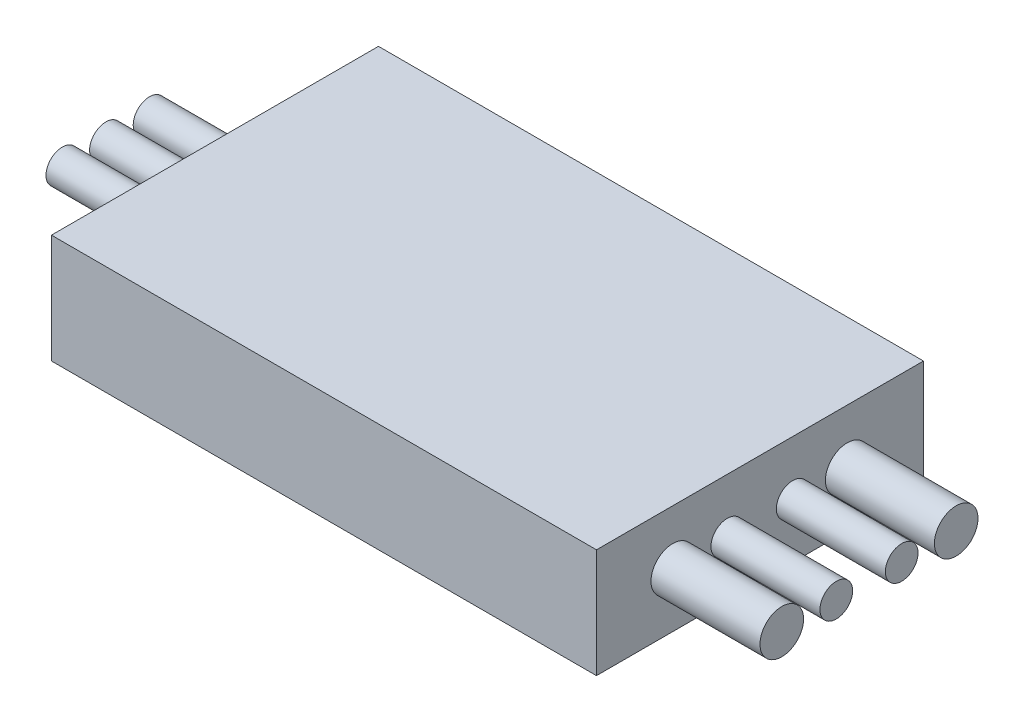
ISO-10303-21;
HEADER;
FILE_DESCRIPTION(('STEP AP214'),'2;1');
FILE_NAME('part.step','',(''),(''),'','','');
FILE_SCHEMA(('AUTOMOTIVE_DESIGN { 1 0 10303 214 1 1 1 1 }'));
ENDSEC;
DATA;
#1=APPLICATION_CONTEXT('core data for automotive mechanical design processes');
#2=APPLICATION_PROTOCOL_DEFINITION('international standard','automotive_design',2000,#1);
#3=PRODUCT_CONTEXT('',#1,'mechanical');
#4=PRODUCT('Part','Part','',(#3));
#5=PRODUCT_RELATED_PRODUCT_CATEGORY('part','',(#4));
#6=PRODUCT_DEFINITION_FORMATION('','',#4);
#7=PRODUCT_DEFINITION_CONTEXT('part definition',#1,'design');
#8=PRODUCT_DEFINITION('design','',#6,#7);
#9=PRODUCT_DEFINITION_SHAPE('','',#8);
#10=(LENGTH_UNIT() NAMED_UNIT(*) SI_UNIT(.MILLI.,.METRE.));
#11=(NAMED_UNIT(*) PLANE_ANGLE_UNIT() SI_UNIT($,.RADIAN.));
#12=(NAMED_UNIT(*) SI_UNIT($,.STERADIAN.) SOLID_ANGLE_UNIT());
#13=UNCERTAINTY_MEASURE_WITH_UNIT(LENGTH_MEASURE(1.E-05),#10,'distance_accuracy_value','');
#14=(GEOMETRIC_REPRESENTATION_CONTEXT(3) GLOBAL_UNCERTAINTY_ASSIGNED_CONTEXT((#13)) GLOBAL_UNIT_ASSIGNED_CONTEXT((#10,
#11,#12)) REPRESENTATION_CONTEXT('',''));
#15=CARTESIAN_POINT('',(0.,0.,0.));
#16=DIRECTION('',(0.,0.,1.));
#17=DIRECTION('',(1.,0.,0.));
#18=AXIS2_PLACEMENT_3D('',#15,#16,#17);
#19=CARTESIAN_POINT('',(0.,5.,0.));
#20=DIRECTION('',(1.,0.,0.));
#21=DIRECTION('',(0.,0.,-1.));
#22=AXIS2_PLACEMENT_3D('',#19,#20,#21);
#23=PLANE('',#22);
#24=CARTESIAN_POINT('',(0.,2.5,-5.5));
#25=DIRECTION('',(1.,0.,0.));
#26=DIRECTION('',(0.,0.,-1.));
#27=AXIS2_PLACEMENT_3D('',#24,#25,#26);
#28=CIRCLE('',#27,0.75);
#29=CARTESIAN_POINT('',(0.,2.5,-6.25));
#30=VERTEX_POINT('',#29);
#31=EDGE_CURVE('E11',#30,#30,#28,.F.);
#32=ORIENTED_EDGE('',*,*,#31,.F.);
#33=EDGE_LOOP('',(#32));
#34=FACE_BOUND('',#33,.T.);
#35=CARTESIAN_POINT('',(0.,2.5,-7.5));
#36=DIRECTION('',(1.,0.,0.));
#37=DIRECTION('',(0.,0.,-1.));
#38=AXIS2_PLACEMENT_3D('',#35,#36,#37);
#39=CIRCLE('',#38,0.75);
#40=CARTESIAN_POINT('',(0.,2.5,-8.25));
#41=VERTEX_POINT('',#40);
#42=EDGE_CURVE('E40',#41,#41,#39,.F.);
#43=ORIENTED_EDGE('',*,*,#42,.F.);
#44=EDGE_LOOP('',(#43));
#45=FACE_BOUND('',#44,.T.);
#46=CARTESIAN_POINT('',(0.,2.5,-9.5));
#47=DIRECTION('',(1.,0.,0.));
#48=DIRECTION('',(0.,0.,-1.));
#49=AXIS2_PLACEMENT_3D('',#46,#47,#48);
#50=CIRCLE('',#49,0.75);
#51=CARTESIAN_POINT('',(0.,2.5,-10.25));
#52=VERTEX_POINT('',#51);
#53=EDGE_CURVE('E121',#52,#52,#50,.F.);
#54=ORIENTED_EDGE('',*,*,#53,.F.);
#55=EDGE_LOOP('',(#54));
#56=FACE_BOUND('',#55,.T.);
#57=DIRECTION('',(0.,0.,1.));
#58=VECTOR('',#57,1.);
#59=CARTESIAN_POINT('',(0.,0.,0.));
#60=LINE('',#59,#58);
#61=CARTESIAN_POINT('',(0.,0.,-15.));
#62=VERTEX_POINT('',#61);
#63=CARTESIAN_POINT('',(0.,0.,0.));
#64=VERTEX_POINT('',#63);
#65=EDGE_CURVE('E99',#62,#64,#60,.T.);
#66=ORIENTED_EDGE('',*,*,#65,.T.);
#67=DIRECTION('',(0.,-1.,0.));
#68=VECTOR('',#67,1.);
#69=CARTESIAN_POINT('',(0.,5.,0.));
#70=LINE('',#69,#68);
#71=CARTESIAN_POINT('',(0.,5.,0.));
#72=VERTEX_POINT('',#71);
#73=EDGE_CURVE('E90',#72,#64,#70,.T.);
#74=ORIENTED_EDGE('',*,*,#73,.F.);
#75=DIRECTION('',(0.,0.,1.));
#76=VECTOR('',#75,1.);
#77=CARTESIAN_POINT('',(0.,5.,0.));
#78=LINE('',#77,#76);
#79=CARTESIAN_POINT('',(0.,5.,-15.));
#80=VERTEX_POINT('',#79);
#81=EDGE_CURVE('E84',#80,#72,#78,.T.);
#82=ORIENTED_EDGE('',*,*,#81,.F.);
#83=DIRECTION('',(0.,-1.,0.));
#84=VECTOR('',#83,1.);
#85=CARTESIAN_POINT('',(0.,5.,-15.));
#86=LINE('',#85,#84);
#87=EDGE_CURVE('E95',#80,#62,#86,.T.);
#88=ORIENTED_EDGE('',*,*,#87,.T.);
#89=EDGE_LOOP('',(#66,#74,#82,#88));
#90=FACE_BOUND('',#89,.T.);
#91=ADVANCED_FACE('F32',(#34,#45,#56,#90),#23,.F.);
#92=CARTESIAN_POINT('',(0.,5.,0.));
#93=DIRECTION('',(0.,0.,-1.));
#94=DIRECTION('',(-1.,0.,0.));
#95=AXIS2_PLACEMENT_3D('',#92,#93,#94);
#96=PLANE('',#95);
#97=DIRECTION('',(1.,0.,0.));
#98=VECTOR('',#97,1.);
#99=CARTESIAN_POINT('',(0.,0.,0.));
#100=LINE('',#99,#98);
#101=CARTESIAN_POINT('',(25.,0.,0.));
#102=VERTEX_POINT('',#101);
#103=EDGE_CURVE('E89',#64,#102,#100,.T.);
#104=ORIENTED_EDGE('',*,*,#103,.T.);
#105=DIRECTION('',(0.,-1.,0.));
#106=VECTOR('',#105,1.);
#107=CARTESIAN_POINT('',(25.,5.,0.));
#108=LINE('',#107,#106);
#109=CARTESIAN_POINT('',(25.,5.,0.));
#110=VERTEX_POINT('',#109);
#111=EDGE_CURVE('E87',#110,#102,#108,.T.);
#112=ORIENTED_EDGE('',*,*,#111,.F.);
#113=DIRECTION('',(1.,0.,0.));
#114=VECTOR('',#113,1.);
#115=CARTESIAN_POINT('',(0.,5.,0.));
#116=LINE('',#115,#114);
#117=EDGE_CURVE('E79',#72,#110,#116,.T.);
#118=ORIENTED_EDGE('',*,*,#117,.F.);
#119=ORIENTED_EDGE('',*,*,#73,.T.);
#120=EDGE_LOOP('',(#104,#112,#118,#119));
#121=FACE_BOUND('',#120,.T.);
#122=ADVANCED_FACE('F88',(#121),#96,.F.);
#123=CARTESIAN_POINT('',(25.,5.,0.));
#124=DIRECTION('',(-1.,0.,0.));
#125=DIRECTION('',(0.,0.,1.));
#126=AXIS2_PLACEMENT_3D('',#123,#124,#125);
#127=PLANE('',#126);
#128=CARTESIAN_POINT('',(25.,2.5,-3.5));
#129=DIRECTION('',(-1.,0.,0.));
#130=DIRECTION('',(0.,0.,1.));
#131=AXIS2_PLACEMENT_3D('',#128,#129,#130);
#132=CIRCLE('',#131,1.);
#133=CARTESIAN_POINT('',(25.,2.5,-2.5));
#134=VERTEX_POINT('',#133);
#135=EDGE_CURVE('E118',#134,#134,#132,.F.);
#136=ORIENTED_EDGE('',*,*,#135,.F.);
#137=EDGE_LOOP('',(#136));
#138=FACE_BOUND('',#137,.T.);
#139=CARTESIAN_POINT('',(25.,2.5,-9.));
#140=DIRECTION('',(-1.,0.,0.));
#141=DIRECTION('',(0.,0.,1.));
#142=AXIS2_PLACEMENT_3D('',#139,#140,#141);
#143=CIRCLE('',#142,0.750000000000002);
#144=CARTESIAN_POINT('',(25.,2.5,-8.25));
#145=VERTEX_POINT('',#144);
#146=EDGE_CURVE('E115',#145,#145,#143,.F.);
#147=ORIENTED_EDGE('',*,*,#146,.F.);
#148=EDGE_LOOP('',(#147));
#149=FACE_BOUND('',#148,.T.);
#150=CARTESIAN_POINT('',(25.,2.5,-6.));
#151=DIRECTION('',(-1.,0.,0.));
#152=DIRECTION('',(0.,0.,1.));
#153=AXIS2_PLACEMENT_3D('',#150,#151,#152);
#154=CIRCLE('',#153,0.75);
#155=CARTESIAN_POINT('',(25.,2.5,-5.25));
#156=VERTEX_POINT('',#155);
#157=EDGE_CURVE('E112',#156,#156,#154,.F.);
#158=ORIENTED_EDGE('',*,*,#157,.F.);
#159=EDGE_LOOP('',(#158));
#160=FACE_BOUND('',#159,.T.);
#161=CARTESIAN_POINT('',(25.,2.5,-11.5));
#162=DIRECTION('',(-1.,0.,0.));
#163=DIRECTION('',(0.,0.,1.));
#164=AXIS2_PLACEMENT_3D('',#161,#162,#163);
#165=CIRCLE('',#164,1.);
#166=CARTESIAN_POINT('',(25.,2.5,-10.5));
#167=VERTEX_POINT('',#166);
#168=EDGE_CURVE('E109',#167,#167,#165,.F.);
#169=ORIENTED_EDGE('',*,*,#168,.F.);
#170=EDGE_LOOP('',(#169));
#171=FACE_BOUND('',#170,.T.);
#172=DIRECTION('',(0.,0.,-1.));
#173=VECTOR('',#172,1.);
#174=CARTESIAN_POINT('',(25.,0.,0.));
#175=LINE('',#174,#173);
#176=CARTESIAN_POINT('',(25.,0.,-15.));
#177=VERTEX_POINT('',#176);
#178=EDGE_CURVE('E65',#102,#177,#175,.T.);
#179=ORIENTED_EDGE('',*,*,#178,.T.);
#180=DIRECTION('',(0.,-1.,0.));
#181=VECTOR('',#180,1.);
#182=CARTESIAN_POINT('',(25.,5.,-15.));
#183=LINE('',#182,#181);
#184=CARTESIAN_POINT('',(25.,5.,-15.));
#185=VERTEX_POINT('',#184);
#186=EDGE_CURVE('E91',#185,#177,#183,.T.);
#187=ORIENTED_EDGE('',*,*,#186,.F.);
#188=DIRECTION('',(0.,0.,-1.));
#189=VECTOR('',#188,1.);
#190=CARTESIAN_POINT('',(25.,5.,0.));
#191=LINE('',#190,#189);
#192=EDGE_CURVE('E82',#110,#185,#191,.T.);
#193=ORIENTED_EDGE('',*,*,#192,.F.);
#194=ORIENTED_EDGE('',*,*,#111,.T.);
#195=EDGE_LOOP('',(#179,#187,#193,#194));
#196=FACE_BOUND('',#195,.T.);
#197=ADVANCED_FACE('F93',(#138,#149,#160,#171,#196),#127,.F.);
#198=CARTESIAN_POINT('',(0.,5.,-15.));
#199=DIRECTION('',(0.,0.,1.));
#200=DIRECTION('',(1.,0.,0.));
#201=AXIS2_PLACEMENT_3D('',#198,#199,#200);
#202=PLANE('',#201);
#203=DIRECTION('',(-1.,0.,0.));
#204=VECTOR('',#203,1.);
#205=CARTESIAN_POINT('',(0.,0.,-15.));
#206=LINE('',#205,#204);
#207=EDGE_CURVE('E71',#177,#62,#206,.T.);
#208=ORIENTED_EDGE('',*,*,#207,.T.);
#209=ORIENTED_EDGE('',*,*,#87,.F.);
#210=DIRECTION('',(-1.,0.,0.));
#211=VECTOR('',#210,1.);
#212=CARTESIAN_POINT('',(0.,5.,-15.));
#213=LINE('',#212,#211);
#214=EDGE_CURVE('E48',#185,#80,#213,.T.);
#215=ORIENTED_EDGE('',*,*,#214,.F.);
#216=ORIENTED_EDGE('',*,*,#186,.T.);
#217=EDGE_LOOP('',(#208,#209,#215,#216));
#218=FACE_BOUND('',#217,.T.);
#219=ADVANCED_FACE('F146',(#218),#202,.F.);
#220=CARTESIAN_POINT('',(0.,5.,0.));
#221=DIRECTION('',(0.,-1.,0.));
#222=DIRECTION('',(0.,0.,-1.));
#223=AXIS2_PLACEMENT_3D('',#220,#221,#222);
#224=PLANE('',#223);
#225=ORIENTED_EDGE('',*,*,#81,.T.);
#226=ORIENTED_EDGE('',*,*,#117,.T.);
#227=ORIENTED_EDGE('',*,*,#192,.T.);
#228=ORIENTED_EDGE('',*,*,#214,.T.);
#229=EDGE_LOOP('',(#225,#226,#227,#228));
#230=FACE_BOUND('',#229,.T.);
#231=ADVANCED_FACE('F80',(#230),#224,.F.);
#232=CARTESIAN_POINT('',(0.,0.,0.));
#233=DIRECTION('',(0.,-1.,0.));
#234=DIRECTION('',(0.,0.,-1.));
#235=AXIS2_PLACEMENT_3D('',#232,#233,#234);
#236=PLANE('',#235);
#237=ORIENTED_EDGE('',*,*,#65,.F.);
#238=ORIENTED_EDGE('',*,*,#207,.F.);
#239=ORIENTED_EDGE('',*,*,#178,.F.);
#240=ORIENTED_EDGE('',*,*,#103,.F.);
#241=EDGE_LOOP('',(#237,#238,#239,#240));
#242=FACE_BOUND('',#241,.T.);
#243=ADVANCED_FACE('F135',(#242),#236,.T.);
#244=CARTESIAN_POINT('',(30.,2.5,-11.5));
#245=DIRECTION('',(-1.,0.,0.));
#246=DIRECTION('',(0.,0.,1.));
#247=AXIS2_PLACEMENT_3D('',#244,#245,#246);
#248=CYLINDRICAL_SURFACE('',#247,1.);
#249=CARTESIAN_POINT('',(30.,2.5,-11.5));
#250=DIRECTION('',(1.,0.,0.));
#251=DIRECTION('',(0.,0.,-1.));
#252=AXIS2_PLACEMENT_3D('',#249,#250,#251);
#253=CIRCLE('',#252,1.);
#254=CARTESIAN_POINT('',(30.,2.5,-12.5));
#255=VERTEX_POINT('',#254);
#256=EDGE_CURVE('E102',#255,#255,#253,.T.);
#257=ORIENTED_EDGE('',*,*,#256,.F.);
#258=EDGE_LOOP('',(#257));
#259=FACE_BOUND('',#258,.T.);
#260=ORIENTED_EDGE('',*,*,#168,.T.);
#261=EDGE_LOOP('',(#260));
#262=FACE_BOUND('',#261,.T.);
#263=ADVANCED_FACE('F137',(#259,#262),#248,.T.);
#264=CARTESIAN_POINT('',(30.,2.5,-11.5));
#265=DIRECTION('',(1.,0.,0.));
#266=DIRECTION('',(0.,0.,-1.));
#267=AXIS2_PLACEMENT_3D('',#264,#265,#266);
#268=PLANE('',#267);
#269=ORIENTED_EDGE('',*,*,#256,.T.);
#270=EDGE_LOOP('',(#269));
#271=FACE_BOUND('',#270,.T.);
#272=ADVANCED_FACE('F143',(#271),#268,.T.);
#273=CARTESIAN_POINT('',(30.,2.5,-6.));
#274=DIRECTION('',(-1.,0.,0.));
#275=DIRECTION('',(0.,0.,1.));
#276=AXIS2_PLACEMENT_3D('',#273,#274,#275);
#277=CYLINDRICAL_SURFACE('',#276,0.75);
#278=CARTESIAN_POINT('',(30.,2.5,-6.));
#279=DIRECTION('',(1.,0.,0.));
#280=DIRECTION('',(0.,0.,-1.));
#281=AXIS2_PLACEMENT_3D('',#278,#279,#280);
#282=CIRCLE('',#281,0.75);
#283=CARTESIAN_POINT('',(30.,2.5,-6.75));
#284=VERTEX_POINT('',#283);
#285=EDGE_CURVE('E329',#284,#284,#282,.T.);
#286=ORIENTED_EDGE('',*,*,#285,.F.);
#287=EDGE_LOOP('',(#286));
#288=FACE_BOUND('',#287,.T.);
#289=ORIENTED_EDGE('',*,*,#157,.T.);
#290=EDGE_LOOP('',(#289));
#291=FACE_BOUND('',#290,.T.);
#292=ADVANCED_FACE('F189',(#288,#291),#277,.T.);
#293=CARTESIAN_POINT('',(30.,2.5,-6.));
#294=DIRECTION('',(1.,0.,0.));
#295=DIRECTION('',(0.,0.,-1.));
#296=AXIS2_PLACEMENT_3D('',#293,#294,#295);
#297=PLANE('',#296);
#298=ORIENTED_EDGE('',*,*,#285,.T.);
#299=EDGE_LOOP('',(#298));
#300=FACE_BOUND('',#299,.T.);
#301=ADVANCED_FACE('F198',(#300),#297,.T.);
#302=CARTESIAN_POINT('',(30.,2.5,-9.));
#303=DIRECTION('',(-1.,0.,0.));
#304=DIRECTION('',(0.,0.,1.));
#305=AXIS2_PLACEMENT_3D('',#302,#303,#304);
#306=CYLINDRICAL_SURFACE('',#305,0.750000000000002);
#307=CARTESIAN_POINT('',(30.,2.5,-9.));
#308=DIRECTION('',(1.,0.,0.));
#309=DIRECTION('',(0.,0.,-1.));
#310=AXIS2_PLACEMENT_3D('',#307,#308,#309);
#311=CIRCLE('',#310,0.750000000000002);
#312=CARTESIAN_POINT('',(30.,2.5,-9.75));
#313=VERTEX_POINT('',#312);
#314=EDGE_CURVE('E326',#313,#313,#311,.T.);
#315=ORIENTED_EDGE('',*,*,#314,.F.);
#316=EDGE_LOOP('',(#315));
#317=FACE_BOUND('',#316,.T.);
#318=ORIENTED_EDGE('',*,*,#146,.T.);
#319=EDGE_LOOP('',(#318));
#320=FACE_BOUND('',#319,.T.);
#321=ADVANCED_FACE('F207',(#317,#320),#306,.T.);
#322=CARTESIAN_POINT('',(30.,2.5,-9.));
#323=DIRECTION('',(1.,0.,0.));
#324=DIRECTION('',(0.,0.,-1.));
#325=AXIS2_PLACEMENT_3D('',#322,#323,#324);
#326=PLANE('',#325);
#327=ORIENTED_EDGE('',*,*,#314,.T.);
#328=EDGE_LOOP('',(#327));
#329=FACE_BOUND('',#328,.T.);
#330=ADVANCED_FACE('F216',(#329),#326,.T.);
#331=CARTESIAN_POINT('',(30.,2.5,-3.5));
#332=DIRECTION('',(-1.,0.,0.));
#333=DIRECTION('',(0.,0.,1.));
#334=AXIS2_PLACEMENT_3D('',#331,#332,#333);
#335=CYLINDRICAL_SURFACE('',#334,1.);
#336=CARTESIAN_POINT('',(30.,2.5,-3.5));
#337=DIRECTION('',(1.,0.,0.));
#338=DIRECTION('',(0.,0.,-1.));
#339=AXIS2_PLACEMENT_3D('',#336,#337,#338);
#340=CIRCLE('',#339,1.);
#341=CARTESIAN_POINT('',(30.,2.5,-4.5));
#342=VERTEX_POINT('',#341);
#343=EDGE_CURVE('E323',#342,#342,#340,.T.);
#344=ORIENTED_EDGE('',*,*,#343,.F.);
#345=EDGE_LOOP('',(#344));
#346=FACE_BOUND('',#345,.T.);
#347=ORIENTED_EDGE('',*,*,#135,.T.);
#348=EDGE_LOOP('',(#347));
#349=FACE_BOUND('',#348,.T.);
#350=ADVANCED_FACE('F225',(#346,#349),#335,.T.);
#351=CARTESIAN_POINT('',(30.,2.5,-3.5));
#352=DIRECTION('',(1.,0.,0.));
#353=DIRECTION('',(0.,0.,-1.));
#354=AXIS2_PLACEMENT_3D('',#351,#352,#353);
#355=PLANE('',#354);
#356=ORIENTED_EDGE('',*,*,#343,.T.);
#357=EDGE_LOOP('',(#356));
#358=FACE_BOUND('',#357,.T.);
#359=ADVANCED_FACE('F234',(#358),#355,.T.);
#360=CARTESIAN_POINT('',(-5.,2.5,-9.5));
#361=DIRECTION('',(1.,0.,0.));
#362=DIRECTION('',(0.,0.,-1.));
#363=AXIS2_PLACEMENT_3D('',#360,#361,#362);
#364=CYLINDRICAL_SURFACE('',#363,0.75);
#365=CARTESIAN_POINT('',(-5.,2.5,-9.5));
#366=DIRECTION('',(-1.,0.,0.));
#367=DIRECTION('',(0.,0.,1.));
#368=AXIS2_PLACEMENT_3D('',#365,#366,#367);
#369=CIRCLE('',#368,0.75);
#370=CARTESIAN_POINT('',(-5.,2.5,-8.75));
#371=VERTEX_POINT('',#370);
#372=EDGE_CURVE('E318',#371,#371,#369,.T.);
#373=ORIENTED_EDGE('',*,*,#372,.F.);
#374=EDGE_LOOP('',(#373));
#375=FACE_BOUND('',#374,.T.);
#376=ORIENTED_EDGE('',*,*,#53,.T.);
#377=EDGE_LOOP('',(#376));
#378=FACE_BOUND('',#377,.T.);
#379=ADVANCED_FACE('F243',(#375,#378),#364,.T.);
#380=CARTESIAN_POINT('',(-5.,2.5,-9.5));
#381=DIRECTION('',(-1.,0.,0.));
#382=DIRECTION('',(0.,0.,1.));
#383=AXIS2_PLACEMENT_3D('',#380,#381,#382);
#384=PLANE('',#383);
#385=ORIENTED_EDGE('',*,*,#372,.T.);
#386=EDGE_LOOP('',(#385));
#387=FACE_BOUND('',#386,.T.);
#388=ADVANCED_FACE('F252',(#387),#384,.T.);
#389=CARTESIAN_POINT('',(-5.,2.5,-7.5));
#390=DIRECTION('',(1.,0.,0.));
#391=DIRECTION('',(0.,0.,-1.));
#392=AXIS2_PLACEMENT_3D('',#389,#390,#391);
#393=CYLINDRICAL_SURFACE('',#392,0.75);
#394=CARTESIAN_POINT('',(-5.,2.5,-7.5));
#395=DIRECTION('',(-1.,0.,0.));
#396=DIRECTION('',(0.,0.,1.));
#397=AXIS2_PLACEMENT_3D('',#394,#395,#396);
#398=CIRCLE('',#397,0.75);
#399=CARTESIAN_POINT('',(-5.,2.5,-6.75));
#400=VERTEX_POINT('',#399);
#401=EDGE_CURVE('E315',#400,#400,#398,.T.);
#402=ORIENTED_EDGE('',*,*,#401,.F.);
#403=EDGE_LOOP('',(#402));
#404=FACE_BOUND('',#403,.T.);
#405=ORIENTED_EDGE('',*,*,#42,.T.);
#406=EDGE_LOOP('',(#405));
#407=FACE_BOUND('',#406,.T.);
#408=ADVANCED_FACE('F126',(#404,#407),#393,.T.);
#409=CARTESIAN_POINT('',(-5.,2.5,-7.5));
#410=DIRECTION('',(-1.,0.,0.));
#411=DIRECTION('',(0.,0.,1.));
#412=AXIS2_PLACEMENT_3D('',#409,#410,#411);
#413=PLANE('',#412);
#414=ORIENTED_EDGE('',*,*,#401,.T.);
#415=EDGE_LOOP('',(#414));
#416=FACE_BOUND('',#415,.T.);
#417=ADVANCED_FACE('F269',(#416),#413,.T.);
#418=CARTESIAN_POINT('',(-5.,2.5,-5.5));
#419=DIRECTION('',(1.,0.,0.));
#420=DIRECTION('',(0.,0.,-1.));
#421=AXIS2_PLACEMENT_3D('',#418,#419,#420);
#422=CYLINDRICAL_SURFACE('',#421,0.75);
#423=CARTESIAN_POINT('',(-5.,2.5,-5.5));
#424=DIRECTION('',(-1.,0.,0.));
#425=DIRECTION('',(0.,0.,1.));
#426=AXIS2_PLACEMENT_3D('',#423,#424,#425);
#427=CIRCLE('',#426,0.75);
#428=CARTESIAN_POINT('',(-5.,2.5,-4.75));
#429=VERTEX_POINT('',#428);
#430=EDGE_CURVE('E314',#429,#429,#427,.T.);
#431=ORIENTED_EDGE('',*,*,#430,.F.);
#432=EDGE_LOOP('',(#431));
#433=FACE_BOUND('',#432,.T.);
#434=ORIENTED_EDGE('',*,*,#31,.T.);
#435=EDGE_LOOP('',(#434));
#436=FACE_BOUND('',#435,.T.);
#437=ADVANCED_FACE('F278',(#433,#436),#422,.T.);
#438=CARTESIAN_POINT('',(-5.,2.5,-5.5));
#439=DIRECTION('',(-1.,0.,0.));
#440=DIRECTION('',(0.,0.,1.));
#441=AXIS2_PLACEMENT_3D('',#438,#439,#440);
#442=PLANE('',#441);
#443=ORIENTED_EDGE('',*,*,#430,.T.);
#444=EDGE_LOOP('',(#443));
#445=FACE_BOUND('',#444,.T.);
#446=ADVANCED_FACE('F287',(#445),#442,.T.);
#447=CLOSED_SHELL('',(#91,#122,#197,#219,#231,#243,#263,#272,#292,#301,#321,#330,#350,#359,#379,
#388,#408,#417,#437,#446));
#448=MANIFOLD_SOLID_BREP('B2',#447);
#449=ADVANCED_BREP_SHAPE_REPRESENTATION('',(#18,#448),#14);
#450=SHAPE_DEFINITION_REPRESENTATION(#9,#449);
ENDSEC;
END-ISO-10303-21;
